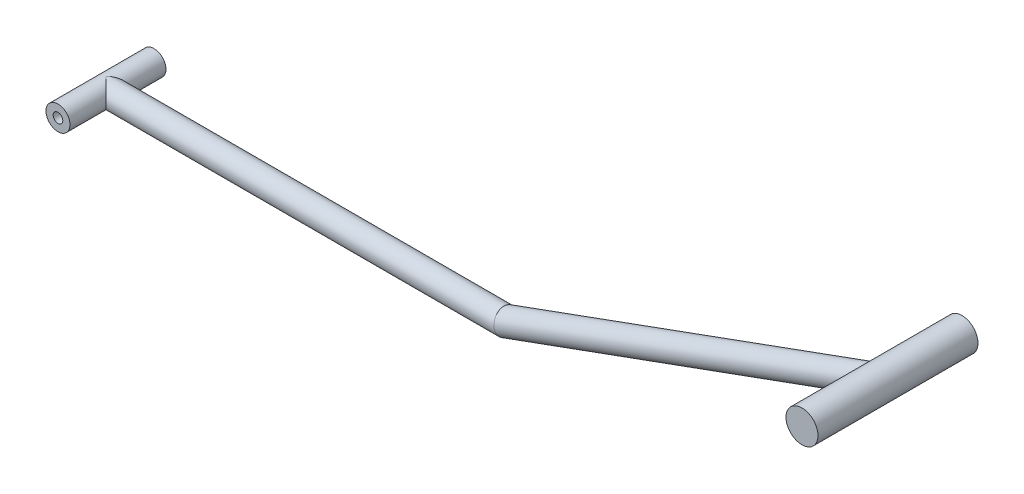
ISO-10303-21;
HEADER;
FILE_DESCRIPTION(('STEP AP214'),'2;1');
FILE_NAME('part.step','',(''),(''),'','','');
FILE_SCHEMA(('AUTOMOTIVE_DESIGN { 1 0 10303 214 1 1 1 1 }'));
ENDSEC;
DATA;
#1=APPLICATION_CONTEXT('core data for automotive mechanical design processes');
#2=APPLICATION_PROTOCOL_DEFINITION('international standard','automotive_design',2000,#1);
#3=PRODUCT_CONTEXT('',#1,'mechanical');
#4=PRODUCT('Part','Part','',(#3));
#5=PRODUCT_RELATED_PRODUCT_CATEGORY('part','',(#4));
#6=PRODUCT_DEFINITION_FORMATION('','',#4);
#7=PRODUCT_DEFINITION_CONTEXT('part definition',#1,'design');
#8=PRODUCT_DEFINITION('design','',#6,#7);
#9=PRODUCT_DEFINITION_SHAPE('','',#8);
#10=(LENGTH_UNIT() NAMED_UNIT(*) SI_UNIT(.MILLI.,.METRE.));
#11=(NAMED_UNIT(*) PLANE_ANGLE_UNIT() SI_UNIT($,.RADIAN.));
#12=(NAMED_UNIT(*) SI_UNIT($,.STERADIAN.) SOLID_ANGLE_UNIT());
#13=UNCERTAINTY_MEASURE_WITH_UNIT(LENGTH_MEASURE(1.E-05),#10,'distance_accuracy_value','');
#14=(GEOMETRIC_REPRESENTATION_CONTEXT(3) GLOBAL_UNCERTAINTY_ASSIGNED_CONTEXT((#13)) GLOBAL_UNIT_ASSIGNED_CONTEXT((#10,
#11,#12)) REPRESENTATION_CONTEXT('',''));
#15=CARTESIAN_POINT('',(0.,0.,0.));
#16=DIRECTION('',(0.,0.,1.));
#17=DIRECTION('',(1.,0.,0.));
#18=AXIS2_PLACEMENT_3D('',#15,#16,#17);
#19=CARTESIAN_POINT('',(500.,0.,0.));
#20=DIRECTION('',(0.939692620785908,0.34202014332567,0.));
#21=DIRECTION('',(-0.34202014332567,0.939692620785908,0.));
#22=AXIS2_PLACEMENT_3D('',#19,#20,#21);
#23=CYLINDRICAL_SURFACE('',#22,15.);
#24=CARTESIAN_POINT('',(500.,0.,0.));
#25=DIRECTION('',(0.984807753012208,0.173648177666931,0.));
#26=DIRECTION('',(-0.173648177666931,0.984807753012208,0.));
#27=AXIS2_PLACEMENT_3D('',#24,#25,#26);
#28=ELLIPSE('',#27,15.2313991782862,15.);
#29=CARTESIAN_POINT('',(497.355095289373,15.,0.));
#30=VERTEX_POINT('',#29);
#31=EDGE_CURVE('E115',#30,#30,#28,.T.);
#32=ORIENTED_EDGE('',*,*,#31,.T.);
#33=EDGE_LOOP('',(#32));
#34=FACE_BOUND('',#33,.T.);
#35=CARTESIAN_POINT('',(952.285043325859,180.580959761552,0.));
#36=CARTESIAN_POINT('',(952.285035394979,180.580951570368,-0.350079890327284));
#37=CARTESIAN_POINT('',(952.276112477174,180.564628821461,-0.700236713845612));
#38=CARTESIAN_POINT('',(952.241103360781,180.49995953954,-1.39674329707936));
#39=CARTESIAN_POINT('',(952.215011435861,180.451602322123,-1.74309174740025));
#40=CARTESIAN_POINT('',(952.14753257883,180.324491398012,-2.42936786240104));
#41=CARTESIAN_POINT('',(952.106112348691,180.245671499881,-2.76927984254844));
#42=CARTESIAN_POINT('',(952.010693107067,180.060022505329,-3.43970761587677));
#43=CARTESIAN_POINT('',(951.956685790914,179.953174911015,-3.7702170432241));
#44=CARTESIAN_POINT('',(951.840013290502,179.715843998583,-4.41546480166884));
#45=CARTESIAN_POINT('',(951.777482856538,179.585720255885,-4.73036101087507));
#46=CARTESIAN_POINT('',(951.646120155267,179.30328046254,-5.34847307548837));
#47=CARTESIAN_POINT('',(951.577290085453,179.150972139626,-5.65169295189166));
#48=CARTESIAN_POINT('',(951.436019291546,178.82624217578,-6.24616943381674));
#49=CARTESIAN_POINT('',(951.36357919823,178.653824041617,-6.53742811320166));
#50=CARTESIAN_POINT('',(951.217506745819,178.290594197341,-7.10791224058057));
#51=CARTESIAN_POINT('',(951.143874300568,178.099781153082,-7.38713681363696));
#52=CARTESIAN_POINT('',(950.982275155464,177.659437756766,-7.99071956284561));
#53=CARTESIAN_POINT('',(950.894536949365,177.405980670003,-8.31227897723427));
#54=CARTESIAN_POINT('',(950.723953464106,176.876323819218,-8.937465429897));
#55=CARTESIAN_POINT('',(950.641108588332,176.600122184705,-9.24109098977483));
#56=CARTESIAN_POINT('',(950.483285290792,176.026239761778,-9.830383058356));
#57=CARTESIAN_POINT('',(950.408318079182,175.72852935508,-10.1160237485836));
#58=CARTESIAN_POINT('',(950.269232209009,175.11342070539,-10.6681497813647));
#59=CARTESIAN_POINT('',(950.20511445171,174.796020829784,-10.9346335314949));
#60=CARTESIAN_POINT('',(950.078682144025,174.076067930734,-11.4998486946517));
#61=CARTESIAN_POINT('',(950.019418657432,173.669376244951,-11.7940279078986));
#62=CARTESIAN_POINT('',(949.925002504532,172.831908304601,-12.35056384938));
#63=CARTESIAN_POINT('',(949.889855252098,172.401126665522,-12.6129134212812));
#64=CARTESIAN_POINT('',(949.847938424697,171.519488023194,-13.1020621368341));
#65=CARTESIAN_POINT('',(949.841114780598,171.068670932341,-13.3289282198199));
#66=CARTESIAN_POINT('',(949.859531178955,170.15025470405,-13.7439395955393));
#67=CARTESIAN_POINT('',(949.884754208737,169.682664598951,-13.9321053715779));
#68=CARTESIAN_POINT('',(949.957431967535,168.878678256954,-14.2155206181018));
#69=CARTESIAN_POINT('',(949.995882802748,168.545265123088,-14.3216751503083));
#70=CARTESIAN_POINT('',(950.09069492342,167.874757382898,-14.5119991391524));
#71=CARTESIAN_POINT('',(950.147051930116,167.537663674627,-14.5961738392267));
#72=CARTESIAN_POINT('',(950.27811800607,166.862289111349,-14.7413760869837));
#73=CARTESIAN_POINT('',(950.352814770171,166.524009201627,-14.8024190854446));
#74=CARTESIAN_POINT('',(950.520690731582,165.848528796575,-14.9005493680025));
#75=CARTESIAN_POINT('',(950.613870591259,165.511328340369,-14.9376357933791));
#76=CARTESIAN_POINT('',(950.818675832146,164.839765727133,-14.9873357006868));
#77=CARTESIAN_POINT('',(950.930348909081,164.505413323198,-14.9998847978291));
#78=CARTESIAN_POINT('',(951.171235639458,163.843080701791,-15.0001136198624));
#79=CARTESIAN_POINT('',(951.300449223488,163.51510045911,-14.9877934431648));
#80=CARTESIAN_POINT('',(951.575314901971,162.867937453886,-14.9384782769663));
#81=CARTESIAN_POINT('',(951.720970241166,162.54875644337,-14.901478409887));
#82=CARTESIAN_POINT('',(952.02723584515,161.921485118932,-14.8033777740602));
#83=CARTESIAN_POINT('',(952.187846010679,161.613394731416,-14.7422771652691));
#84=CARTESIAN_POINT('',(952.516552769728,161.02055609772,-14.5993796559604));
#85=CARTESIAN_POINT('',(952.684202095385,160.735369501426,-14.5183665754015));
#86=CARTESIAN_POINT('',(953.030165060002,160.178417430502,-14.3357338481969));
#87=CARTESIAN_POINT('',(953.208478377782,159.906651552115,-14.2341148219448));
#88=CARTESIAN_POINT('',(953.574043081298,159.377499112088,-14.0114083976574));
#89=CARTESIAN_POINT('',(953.761294921958,159.120113283766,-13.8903200079904));
#90=CARTESIAN_POINT('',(954.143004679217,158.62035466796,-13.6298601756865));
#91=CARTESIAN_POINT('',(954.33746357578,158.377983934181,-13.4904862401191));
#92=CARTESIAN_POINT('',(954.753201605071,157.883250045754,-13.1786322414654));
#93=CARTESIAN_POINT('',(954.975106408877,157.632642372954,-13.0042018371786));
#94=CARTESIAN_POINT('',(955.423385773005,157.150503516616,-12.6358530539303));
#95=CARTESIAN_POINT('',(955.649760605216,156.918973497928,-12.4419334865935));
#96=CARTESIAN_POINT('',(956.104948565098,156.474729346754,-12.0358210694147));
#97=CARTESIAN_POINT('',(956.333763212955,156.262027818733,-11.823616163475));
#98=CARTESIAN_POINT('',(956.79156569241,155.855289517769,-11.3821811130354));
#99=CARTESIAN_POINT('',(957.020553539192,155.661254636006,-11.1529492476373));
#100=CARTESIAN_POINT('',(957.521450020052,155.255034021643,-10.6316991686251));
#101=CARTESIAN_POINT('',(957.792940310002,155.046786779839,-10.3362007154334));
#102=CARTESIAN_POINT('',(958.329402443913,154.655528748979,-9.72330383845392));
#103=CARTESIAN_POINT('',(958.594373019683,154.472522838386,-9.40590119891696));
#104=CARTESIAN_POINT('',(959.113814321785,154.130788109924,-8.74979915450473));
#105=CARTESIAN_POINT('',(959.36827942119,153.972072182119,-8.41108857565753));
#106=CARTESIAN_POINT('',(959.861870525601,153.67821098656,-7.71294764061107));
#107=CARTESIAN_POINT('',(960.100999951176,153.543060450987,-7.35352193904446));
#108=CARTESIAN_POINT('',(960.513323576251,153.319990017521,-6.68701295227658));
#109=CARTESIAN_POINT('',(960.690223905214,153.22801132422,-6.38357579620483));
#110=CARTESIAN_POINT('',(961.027228109249,153.058488083565,-5.76355405942485));
#111=CARTESIAN_POINT('',(961.187332174789,152.980943372522,-5.44696962786276));
#112=CARTESIAN_POINT('',(961.486584287395,152.840253792041,-4.80163600989984));
#113=CARTESIAN_POINT('',(961.625770735245,152.77708242347,-4.47291052978984));
#114=CARTESIAN_POINT('',(961.879229661384,152.664912423681,-3.80362399006014));
#115=CARTESIAN_POINT('',(961.993508634505,152.615910096677,-3.46306604277392));
#116=CARTESIAN_POINT('',(962.17300642091,152.540423090953,-2.84026434696773));
#117=CARTESIAN_POINT('',(962.243459415962,152.511400625758,-2.55983497252525));
#118=CARTESIAN_POINT('',(962.363415974223,152.462551453581,-1.99372983448262));
#119=CARTESIAN_POINT('',(962.412922219082,152.442723569457,-1.70805474733884));
#120=CARTESIAN_POINT('',(962.489264074328,152.412341423278,-1.13349558316199));
#121=CARTESIAN_POINT('',(962.516124282461,152.401777098798,-0.844615334096654));
#122=CARTESIAN_POINT('',(962.546272589505,152.389928866487,-0.265421830879197));
#123=CARTESIAN_POINT('',(962.549560446007,152.388645054093,0.0248914379789201));
#124=CARTESIAN_POINT('',(962.532433883311,152.395365355506,0.60479891875916));
#125=CARTESIAN_POINT('',(962.512011662527,152.403372526427,0.894392862565568));
#126=CARTESIAN_POINT('',(962.448220684865,152.428644590126,1.47060869461543));
#127=CARTESIAN_POINT('',(962.404851901696,152.445909493513,1.7572305794532));
#128=CARTESIAN_POINT('',(962.296615599498,152.489663952572,2.32600868418188));
#129=CARTESIAN_POINT('',(962.23172147793,152.516164924899,2.60815892332707));
#130=CARTESIAN_POINT('',(962.08243626933,152.578338601556,3.16634198771798));
#131=CARTESIAN_POINT('',(961.998033747456,152.614016686438,3.4423711206758));
#132=CARTESIAN_POINT('',(961.777170805841,152.709569708567,4.08915667335912));
#133=CARTESIAN_POINT('',(961.633048959773,152.773503233812,4.45670766039744));
#134=CARTESIAN_POINT('',(961.318175930523,152.918611471092,5.17650775566839));
#135=CARTESIAN_POINT('',(961.14742467208,152.999786231854,5.52875682065046));
#136=CARTESIAN_POINT('',(960.784332848733,153.179713458969,6.21795386001166));
#137=CARTESIAN_POINT('',(960.591958312621,153.278493731107,6.55487655591859));
#138=CARTESIAN_POINT('',(960.190489126647,153.493878827728,7.21256450610925));
#139=CARTESIAN_POINT('',(959.981395987555,153.610482042515,7.53333121606179));
#140=CARTESIAN_POINT('',(959.542742856393,153.866464924243,8.16973820461784));
#141=CARTESIAN_POINT('',(959.312719829831,154.00650613084,8.48479239336122));
#142=CARTESIAN_POINT('',(958.842662359113,154.306852215789,9.09725927872138));
#143=CARTESIAN_POINT('',(958.602627876274,154.467157172443,9.3946719071631));
#144=CARTESIAN_POINT('',(958.115696321532,154.808800466309,9.97152383545821));
#145=CARTESIAN_POINT('',(957.868796276479,154.990148027433,10.2509551692431));
#146=CARTESIAN_POINT('',(957.371198150541,155.374520824421,10.7909545658105));
#147=CARTESIAN_POINT('',(957.120499641853,155.577548517831,11.0515204844788));
#148=CARTESIAN_POINT('',(956.56321894267,156.05275787465,11.6074930001008));
#149=CARTESIAN_POINT('',(956.256396307295,156.330356233547,11.8980704729058));
#150=CARTESIAN_POINT('',(955.646361133061,156.919602955636,12.4470273815063));
#151=CARTESIAN_POINT('',(955.343149427752,157.231259018016,12.7053995084891));
#152=CARTESIAN_POINT('',(954.746152769952,157.888261096336,13.1861994708642));
#153=CARTESIAN_POINT('',(954.452352592608,158.233548625413,13.408687980918));
#154=CARTESIAN_POINT('',(953.879225891524,158.957478202446,13.8144291894272));
#155=CARTESIAN_POINT('',(953.599891618469,159.336102092494,13.997703063275));
#156=CARTESIAN_POINT('',(953.143416141939,160.004451531797,14.271893629202));
#157=CARTESIAN_POINT('',(952.961068721927,160.286116270991,14.373936583565));
#158=CARTESIAN_POINT('',(952.607966661532,160.863451611545,14.5559953401007));
#159=CARTESIAN_POINT('',(952.437209266801,161.159118856679,14.6360163896429));
#160=CARTESIAN_POINT('',(952.109193148003,161.762769724231,14.7729141880236));
#161=CARTESIAN_POINT('',(951.951925054529,162.07074457646,14.8298071056261));
#162=CARTESIAN_POINT('',(951.652386902636,162.697327398779,14.9196977597463));
#163=CARTESIAN_POINT('',(951.510117404771,163.0159357657,14.952694603447));
#164=CARTESIAN_POINT('',(951.241657695481,163.662306742603,14.9943238587307));
#165=CARTESIAN_POINT('',(951.115506282761,163.990089209112,15.0028984998101));
#166=CARTESIAN_POINT('',(950.88073804593,164.651593741919,14.9953811079746));
#167=CARTESIAN_POINT('',(950.772121146123,164.985315782568,14.9792891815465));
#168=CARTESIAN_POINT('',(950.573061556681,165.656163626906,14.9226897715005));
#169=CARTESIAN_POINT('',(950.482622972056,165.993290181388,14.8821767813829));
#170=CARTESIAN_POINT('',(950.320193224634,166.668268902387,14.7773548477151));
#171=CARTESIAN_POINT('',(950.248202011214,167.006121066909,14.713045969468));
#172=CARTESIAN_POINT('',(950.124336335895,167.670234721735,14.5637744447823));
#173=CARTESIAN_POINT('',(950.071936474842,167.996546913817,14.4794687585441));
#174=CARTESIAN_POINT('',(949.983890799455,168.645436864423,14.2903589794548));
#175=CARTESIAN_POINT('',(949.948244542876,168.968014721303,14.1855554277883));
#176=CARTESIAN_POINT('',(949.89296029807,169.607618888372,13.9566061086172));
#177=CARTESIAN_POINT('',(949.873323007218,169.924644956128,13.8324594987793));
#178=CARTESIAN_POINT('',(949.8491049196,170.551580361661,13.5660152984597));
#179=CARTESIAN_POINT('',(949.844526193073,170.861488715083,13.4237152150451));
#180=CARTESIAN_POINT('',(949.849600141078,171.507418536314,13.1050742462934));
#181=CARTESIAN_POINT('',(949.860922267886,171.842425389542,12.9267034353408));
#182=CARTESIAN_POINT('',(949.899188220331,172.500350349657,12.5504514430559));
#183=CARTESIAN_POINT('',(949.926133050445,172.823267677815,12.3525690078846));
#184=CARTESIAN_POINT('',(949.993879170963,173.455937523302,11.9384878595635));
#185=CARTESIAN_POINT('',(950.034690599591,173.765680221355,11.7222758322299));
#186=CARTESIAN_POINT('',(950.128290445003,174.370636902232,11.2727851475034));
#187=CARTESIAN_POINT('',(950.181080055504,174.665849433442,11.0395047906924));
#188=CARTESIAN_POINT('',(950.308128050934,175.297579377575,10.5090255588309));
#189=CARTESIAN_POINT('',(950.384567593333,175.63071430076,10.2083115792526));
#190=CARTESIAN_POINT('',(950.548311766677,176.272871978233,9.58480793920664));
#191=CARTESIAN_POINT('',(950.635618611421,176.581889798653,9.26201378679727));
#192=CARTESIAN_POINT('',(950.817294110446,177.17387141365,8.59493671544249));
#193=CARTESIAN_POINT('',(950.911665896384,177.456823528709,8.25064427836343));
#194=CARTESIAN_POINT('',(951.103149020438,177.99399159523,7.54109685973961));
#195=CARTESIAN_POINT('',(951.200259643056,178.248214966512,7.17584732773013));
#196=CARTESIAN_POINT('',(951.371580238919,178.673293211129,6.50569680145405));
#197=CARTESIAN_POINT('',(951.446207165951,178.850296309699,6.20479543270992));
#198=CARTESIAN_POINT('',(951.591454196701,179.182777718729,5.59032001058236));
#199=CARTESIAN_POINT('',(951.662074290292,179.338255974779,5.27674592516712));
#200=CARTESIAN_POINT('',(951.796178260846,179.625044042555,4.63807310455017));
#201=CARTESIAN_POINT('',(951.859677670365,179.756406873419,4.31300157182171));
#202=CARTESIAN_POINT('',(951.976527090705,179.992736137374,3.6516319103328));
#203=CARTESIAN_POINT('',(952.029880648593,180.097711799766,3.31533775359901));
#204=CARTESIAN_POINT('',(952.109599742505,180.252055262972,2.73320744189122));
#205=CARTESIAN_POINT('',(952.139292246899,180.308703873345,2.48974190614368));
#206=CARTESIAN_POINT('',(952.191030902576,180.406569991839,1.9989433993067));
#207=CARTESIAN_POINT('',(952.213078543796,180.447790506928,1.7516111916395));
#208=CARTESIAN_POINT('',(952.248703618808,180.514053109089,1.25425989973619));
#209=CARTESIAN_POINT('',(952.26228417828,180.539101166454,1.00424184171237));
#210=CARTESIAN_POINT('',(952.280456014645,180.572555832482,0.502828901264622));
#211=CARTESIAN_POINT('',(952.285049021973,180.580965644622,0.251434293226218));
#212=CARTESIAN_POINT('',(952.285043325859,180.580959761552,0.));
#213=B_SPLINE_CURVE_WITH_KNOTS('',3,(#35,#36,#37,#38,#39,#40,#41,#42,#43,#44,#45,#46,#47,#48,
#49,#50,#51,#52,#53,#54,#55,#56,#57,#58,#59,#60,#61,#62,#63,#64,#65,#66,#67,#68,#69,#70,#71,#72,
#73,#74,#75,#76,#77,#78,#79,#80,#81,#82,#83,#84,#85,#86,#87,#88,#89,#90,#91,#92,#93,#94,#95,#96,
#97,#98,#99,#100,#101,#102,#103,#104,#105,#106,#107,#108,#109,#110,#111,#112,#113,#114,#115,
#116,#117,#118,#119,#120,#121,#122,#123,#124,#125,#126,#127,#128,#129,#130,#131,#132,#133,#134,
#135,#136,#137,#138,#139,#140,#141,#142,#143,#144,#145,#146,#147,#148,#149,#150,#151,#152,#153,
#154,#155,#156,#157,#158,#159,#160,#161,#162,#163,#164,#165,#166,#167,#168,#169,#170,#171,#172,
#173,#174,#175,#176,#177,#178,#179,#180,#181,#182,#183,#184,#185,#186,#187,#188,#189,#190,#191,
#192,#193,#194,#195,#196,#197,#198,#199,#200,#201,#202,#203,#204,#205,#206,#207,#208,#209,#210,
#211,#212),.UNSPECIFIED.,.T.,.F.,(4,2,2,2,2,2,2,2,2,2,2,2,2,2,2,2,2,2,2,2,2,2,2,2,2,2,2,2,2,2,2,
2,2,2,2,2,2,2,2,2,2,2,2,2,2,2,2,2,2,2,2,2,2,2,2,2,2,2,2,2,2,2,2,2,2,2,2,2,2,2,2,2,2,2,2,2,2,2,2,
2,2,2,2,2,2,2,2,2,4),(0.,1.04989330861707,2.10013696283709,3.15267560731795,4.20591066822563,
5.24409491293168,6.28191837964795,7.31956113954815,8.35727921425447,9.61238500518639,
10.8675941180987,12.1245659086802,13.3816420646878,14.8958300903929,16.4103579261516,
17.9219932288364,19.4328263822248,20.4878122457487,21.5425462048999,22.5965744093588,
23.6506403932288,24.7074685043305,25.7642924334172,26.8213252901473,27.8783511314817,
28.8990338141558,29.9196857711866,30.9403897294913,31.9612329887076,33.0925115159598,
34.2238590661887,35.3559583421495,36.4881721943809,37.8431193809283,39.1983280761279,
40.5542534701804,41.9098753703413,42.9983087099467,44.0867297054508,45.1731274949132,
46.2592416572738,47.1301725976503,48.000992005808,48.8708643215188,49.7407455827083,
50.610913151615,51.4810817175363,52.352329731439,53.2240897280179,54.4220718811335,
55.6200574201,56.8199520758416,58.0197384258866,59.2621109686762,60.50448831225,
61.7474123171765,62.9904773633283,64.505180576884,66.0202269199128,67.5326840275837,
69.0443223554228,70.095408171734,71.1462433185052,72.196342562949,73.2464810396968,
74.2991015548625,75.351717525825,76.4045709311067,77.4574214470611,78.4795702327711,
79.5016920353465,80.523858360771,81.5461652070034,82.6841827772837,83.8222735255745,
84.9611981580044,86.1002363428384,87.4646132818952,88.8292686170736,90.1945324824972,
91.5594429292258,92.6296192030637,93.6997981820693,94.7675953717634,95.8350185623947,
96.5896437436551,97.3441217702318,98.0983211110213,98.852375226407),.UNSPECIFIED.);
#214=CARTESIAN_POINT('',(952.285043325859,180.580959761552,0.));
#215=VERTEX_POINT('',#214);
#216=EDGE_CURVE('E39',#215,#215,#213,.T.);
#217=ORIENTED_EDGE('',*,*,#216,.T.);
#218=EDGE_LOOP('',(#217));
#219=FACE_BOUND('',#218,.T.);
#220=ADVANCED_FACE('F35',(#34,#219),#23,.T.);
#221=CARTESIAN_POINT('',(0.,0.,60.));
#222=DIRECTION('',(0.,0.,-1.));
#223=DIRECTION('',(-1.,0.,0.));
#224=AXIS2_PLACEMENT_3D('',#221,#222,#223);
#225=CYLINDRICAL_SURFACE('',#224,15.);
#226=CARTESIAN_POINT('',(0.,0.,-60.));
#227=DIRECTION('',(0.,0.,1.));
#228=DIRECTION('',(1.,0.,0.));
#229=AXIS2_PLACEMENT_3D('',#226,#227,#228);
#230=CIRCLE('',#229,15.);
#231=CARTESIAN_POINT('',(15.,0.,-60.));
#232=VERTEX_POINT('',#231);
#233=EDGE_CURVE('E136',#232,#232,#230,.T.);
#234=ORIENTED_EDGE('',*,*,#233,.T.);
#235=EDGE_LOOP('',(#234));
#236=FACE_BOUND('',#235,.T.);
#237=CARTESIAN_POINT('',(0.,0.,60.));
#238=DIRECTION('',(0.,0.,1.));
#239=DIRECTION('',(1.,0.,0.));
#240=AXIS2_PLACEMENT_3D('',#237,#238,#239);
#241=CIRCLE('',#240,15.);
#242=CARTESIAN_POINT('',(15.,0.,60.));
#243=VERTEX_POINT('',#242);
#244=EDGE_CURVE('E82',#243,#243,#241,.T.);
#245=ORIENTED_EDGE('',*,*,#244,.F.);
#246=EDGE_LOOP('',(#245));
#247=FACE_BOUND('',#246,.T.);
#248=CARTESIAN_POINT('',(0.,0.,0.));
#249=DIRECTION('',(-0.707106781186547,0.,-0.707106781186547));
#250=DIRECTION('',(0.707106781186547,0.,-0.707106781186547));
#251=AXIS2_PLACEMENT_3D('',#248,#249,#250);
#252=ELLIPSE('',#251,21.2132034355964,15.);
#253=CARTESIAN_POINT('',(0.,-15.,0.));
#254=VERTEX_POINT('',#253);
#255=CARTESIAN_POINT('',(0.,15.,0.));
#256=VERTEX_POINT('',#255);
#257=EDGE_CURVE('E130',#254,#256,#252,.F.);
#258=ORIENTED_EDGE('',*,*,#257,.F.);
#259=CARTESIAN_POINT('',(0.,0.,0.));
#260=DIRECTION('',(0.707106781186547,0.,-0.707106781186547));
#261=DIRECTION('',(-0.707106781186547,0.,-0.707106781186547));
#262=AXIS2_PLACEMENT_3D('',#259,#260,#261);
#263=ELLIPSE('',#262,21.2132034355964,15.);
#264=EDGE_CURVE('E54',#256,#254,#263,.T.);
#265=ORIENTED_EDGE('',*,*,#264,.F.);
#266=EDGE_LOOP('',(#258,#265));
#267=FACE_BOUND('',#266,.T.);
#268=ADVANCED_FACE('F37',(#236,#247,#267),#225,.T.);
#269=CARTESIAN_POINT('',(0.,0.,60.));
#270=DIRECTION('',(0.,0.,-1.));
#271=DIRECTION('',(-1.,0.,0.));
#272=AXIS2_PLACEMENT_3D('',#269,#270,#271);
#273=CYLINDRICAL_SURFACE('',#272,6.);
#274=CARTESIAN_POINT('',(0.,0.,-60.));
#275=DIRECTION('',(0.,0.,1.));
#276=DIRECTION('',(1.,0.,0.));
#277=AXIS2_PLACEMENT_3D('',#274,#275,#276);
#278=CIRCLE('',#277,6.);
#279=CARTESIAN_POINT('',(6.,0.,-60.));
#280=VERTEX_POINT('',#279);
#281=EDGE_CURVE('E132',#280,#280,#278,.T.);
#282=ORIENTED_EDGE('',*,*,#281,.F.);
#283=EDGE_LOOP('',(#282));
#284=FACE_BOUND('',#283,.T.);
#285=CARTESIAN_POINT('',(0.,0.,60.));
#286=DIRECTION('',(0.,0.,1.));
#287=DIRECTION('',(1.,0.,0.));
#288=AXIS2_PLACEMENT_3D('',#285,#286,#287);
#289=CIRCLE('',#288,6.);
#290=CARTESIAN_POINT('',(6.,0.,60.));
#291=VERTEX_POINT('',#290);
#292=EDGE_CURVE('E133',#291,#291,#289,.T.);
#293=ORIENTED_EDGE('',*,*,#292,.T.);
#294=EDGE_LOOP('',(#293));
#295=FACE_BOUND('',#294,.T.);
#296=CARTESIAN_POINT('',(-6.,0.,15.));
#297=CARTESIAN_POINT('',(-5.99999907633706,0.161313644504795,14.9999992799423));
#298=CARTESIAN_POINT('',(-5.99348550139582,0.322689516963508,14.9973905442872));
#299=CARTESIAN_POINT('',(-5.96748987821247,0.644299623195491,14.9870209396163));
#300=CARTESIAN_POINT('',(-5.94799916844521,0.80453302218813,14.9792566295469));
#301=CARTESIAN_POINT('',(-5.89618961968034,1.12295032515216,14.9587594719095));
#302=CARTESIAN_POINT('',(-5.86384328218401,1.28112908028619,14.9460159747332));
#303=CARTESIAN_POINT('',(-5.78663177014574,1.59401110108469,14.9158923525357));
#304=CARTESIAN_POINT('',(-5.741761479865,1.74871291854088,14.8985103329152));
#305=CARTESIAN_POINT('',(-5.64011880463919,2.05297112205075,14.85963474988));
#306=CARTESIAN_POINT('',(-5.58339119593629,2.20254446893524,14.8381566801894));
#307=CARTESIAN_POINT('',(-5.45840170244081,2.49626491179011,14.7915782226374));
#308=CARTESIAN_POINT('',(-5.39013550937534,2.64040995626988,14.7664764822838));
#309=CARTESIAN_POINT('',(-5.24266819714285,2.92227692731373,14.7132880124765));
#310=CARTESIAN_POINT('',(-5.16347555520486,3.06000372368526,14.6852036009652));
#311=CARTESIAN_POINT('',(-4.99467518366883,3.32842124549353,14.6267056927006));
#312=CARTESIAN_POINT('',(-4.90506368451759,3.45910939916273,14.5962913543435));
#313=CARTESIAN_POINT('',(-4.61340096802569,3.8503463050522,14.4999578839521));
#314=CARTESIAN_POINT('',(-4.39475150378829,4.09812078052022,14.4312855983673));
#315=CARTESIAN_POINT('',(-3.91972848220131,4.55459108369287,14.2938006085538));
#316=CARTESIAN_POINT('',(-3.66333657769938,4.76326779263536,14.2249878521747));
#317=CARTESIAN_POINT('',(-3.24887569858755,5.04723766459798,14.1257237119283));
#318=CARTESIAN_POINT('',(-3.1022648970436,5.13866506559553,14.0926348838902));
#319=CARTESIAN_POINT('',(-2.8012358186711,5.30875946518037,14.0294439987206));
#320=CARTESIAN_POINT('',(-2.64682078712387,5.38743171147838,13.9993407152693));
#321=CARTESIAN_POINT('',(-2.33114969334845,5.53135072514938,13.9431035259271));
#322=CARTESIAN_POINT('',(-2.1698931693136,5.59659658448498,13.9169698885377));
#323=CARTESIAN_POINT('',(-1.84174929930481,5.71298893930062,13.8695965651366));
#324=CARTESIAN_POINT('',(-1.67486482116359,5.76414249748569,13.8483544285077));
#325=CARTESIAN_POINT('',(-1.34428057885177,5.84985002952935,13.812361071961));
#326=CARTESIAN_POINT('',(-1.18077440622038,5.88504634552834,13.7973611781672));
#327=CARTESIAN_POINT('',(-0.851047582104776,5.94169028877152,13.7730632035884));
#328=CARTESIAN_POINT('',(-0.684828191369743,5.96314412514811,13.763762547854));
#329=CARTESIAN_POINT('',(-0.350984079492432,5.99206783200916,13.7511953307051));
#330=CARTESIAN_POINT('',(-0.183359662748449,5.99954065663821,13.7479274945764));
#331=CARTESIAN_POINT('',(0.151929099875551,6.00041818162586,13.7475446397));
#332=CARTESIAN_POINT('',(0.319593443528542,5.99382353813072,13.7504293339811));
#333=CARTESIAN_POINT('',(0.641884927740917,5.96760177471961,13.7618280557533));
#334=CARTESIAN_POINT('',(0.796604370498164,5.94891756277296,13.7699346208222));
#335=CARTESIAN_POINT('',(1.10384080655501,5.8996396544996,13.7911192754836));
#336=CARTESIAN_POINT('',(1.25635705783037,5.86904203850858,13.8041990012772));
#337=CARTESIAN_POINT('',(1.55807979901831,5.79624600676145,13.8349228158605));
#338=CARTESIAN_POINT('',(1.7072870764518,5.75405038400524,13.8525658056772));
#339=CARTESIAN_POINT('',(2.00156268396213,5.65841794933909,13.8919033105674));
#340=CARTESIAN_POINT('',(2.14662939897561,5.60497681726873,13.9135993823432));
#341=CARTESIAN_POINT('',(2.43458921196665,5.48612076549079,13.9608971317125));
#342=CARTESIAN_POINT('',(2.57738076705269,5.42048769239742,13.9865682596972));
#343=CARTESIAN_POINT('',(2.85699543036736,5.27846344073437,14.0407834641431));
#344=CARTESIAN_POINT('',(2.99381649693463,5.20206861926844,14.0693285125008));
#345=CARTESIAN_POINT('',(3.26075619750076,5.03904071569064,14.1285380661927));
#346=CARTESIAN_POINT('',(3.39087393057647,4.95240626250741,14.1592028551284));
#347=CARTESIAN_POINT('',(3.64375143276673,4.7694272064266,14.2218815851021));
#348=CARTESIAN_POINT('',(3.76651082161022,4.67308210238212,14.2538955957211));
#349=CARTESIAN_POINT('',(4.01328743918054,4.46337699329053,14.321009166178));
#350=CARTESIAN_POINT('',(4.13666401644284,4.34927691149483,14.3561554862976));
#351=CARTESIAN_POINT('',(4.37341997604956,4.11112913327325,14.4261573040414));
#352=CARTESIAN_POINT('',(4.48680229611004,3.98708438059708,14.46101288438));
#353=CARTESIAN_POINT('',(4.70297656358241,3.72964838124062,14.5295379121774));
#354=CARTESIAN_POINT('',(4.80576237352026,3.59625179230496,14.563206664882));
#355=CARTESIAN_POINT('',(4.99993388757555,3.32099627612082,14.6284304794354));
#356=CARTESIAN_POINT('',(5.09132414487588,3.17914076240928,14.6599863831411));
#357=CARTESIAN_POINT('',(5.26379970633357,2.88480363244261,14.7207656025778));
#358=CARTESIAN_POINT('',(5.34463859680639,2.73216491576377,14.7499286757954));
#359=CARTESIAN_POINT('',(5.49305024742827,2.41997061448609,14.8043518853361));
#360=CARTESIAN_POINT('',(5.56062834419929,2.26041784404165,14.8296135908351));
#361=CARTESIAN_POINT('',(5.68189175291899,1.93550182558386,14.875508159045));
#362=CARTESIAN_POINT('',(5.73557981900943,1.77013973685015,14.8961419392815));
#363=CARTESIAN_POINT('',(5.82850487317263,1.43484781894989,14.9321676804159));
#364=CARTESIAN_POINT('',(5.86774286179574,1.26491830691483,14.9475600042365));
#365=CARTESIAN_POINT('',(5.92943749531374,0.932043665210946,14.9718895403));
#366=CARTESIAN_POINT('',(5.95275025468264,0.769280790194169,14.9811550169986));
#367=CARTESIAN_POINT('',(5.9859416474469,0.442179347982648,14.9943744084218));
#368=CARTESIAN_POINT('',(5.99582094260848,0.277840858808295,14.9983285847944));
#369=CARTESIAN_POINT('',(6.00203664635711,-0.0510959013325353,15.000814515054));
#370=CARTESIAN_POINT('',(5.99837604239609,-0.215694106984594,14.9993474650838));
#371=CARTESIAN_POINT('',(5.97755913806226,-0.543895620115942,14.9910347173186));
#372=CARTESIAN_POINT('',(5.96040309644145,-0.707498946609736,14.9841891226479));
#373=CARTESIAN_POINT('',(5.91386131774214,-1.02510006060182,14.9657383242369));
#374=CARTESIAN_POINT('',(5.88506327725836,-1.17919782151467,14.9543621875242));
#375=CARTESIAN_POINT('',(5.81560059386885,-1.48434586639605,14.9271627907189));
#376=CARTESIAN_POINT('',(5.77493206810542,-1.63539513588515,14.9113380755507));
#377=CARTESIAN_POINT('',(5.68211166216053,-1.93337901855315,14.8756364442751));
#378=CARTESIAN_POINT('',(5.62996296955663,-2.08031476115196,14.8557606531008));
#379=CARTESIAN_POINT('',(5.51459039707872,-2.36928412673676,14.8124221315374));
#380=CARTESIAN_POINT('',(5.45136230411881,-2.51131586022716,14.788958037083));
#381=CARTESIAN_POINT('',(5.31225631978153,-2.79382655828656,14.738240986786));
#382=CARTESIAN_POINT('',(5.2360540127242,-2.93412902369548,14.7108949918607));
#383=CARTESIAN_POINT('',(5.07295579131656,-3.20788342050321,14.653636047145));
#384=CARTESIAN_POINT('',(4.98605621255941,-3.34133298209497,14.6237222187979));
#385=CARTESIAN_POINT('',(4.80214466849659,-3.60064969677007,14.5620427444401));
#386=CARTESIAN_POINT('',(4.70513099772341,-3.72651556540458,14.5302767865174));
#387=CARTESIAN_POINT('',(4.50158537994664,-3.97000140926484,14.4656475212144));
#388=CARTESIAN_POINT('',(4.3950530183189,-4.08762102489383,14.4327841660717));
#389=CARTESIAN_POINT('',(4.16569829883037,-4.32151965753384,14.3645492876992));
#390=CARTESIAN_POINT('',(4.04226426963706,-4.4371933374226,14.3291558684875));
#391=CARTESIAN_POINT('',(3.78601523693189,-4.65775251008147,14.2589878283471));
#392=CARTESIAN_POINT('',(3.65320316765098,-4.76264135223885,14.2242130180919));
#393=CARTESIAN_POINT('',(3.3788427625011,-4.9610580489563,14.1562321861325));
#394=CARTESIAN_POINT('',(3.23728947765581,-5.05457937701834,14.1230270722696));
#395=CARTESIAN_POINT('',(2.94639783208029,-5.22948651451797,14.0592011706988));
#396=CARTESIAN_POINT('',(2.79706277899756,-5.31087742412303,14.0285792992444));
#397=CARTESIAN_POINT('',(2.48989739915933,-5.46168285847214,13.9705625756139));
#398=CARTESIAN_POINT('',(2.33199586936957,-5.53096653567013,13.9432038872192));
#399=CARTESIAN_POINT('',(2.01024592899011,-5.65585321672464,13.8930146747533));
#400=CARTESIAN_POINT('',(1.84640009801527,-5.71146207536686,13.8701822136217));
#401=CARTESIAN_POINT('',(1.51396706306604,-5.80843082990244,13.8298551049057));
#402=CARTESIAN_POINT('',(1.34538176688005,-5.84979637281906,13.8123583422014));
#403=CARTESIAN_POINT('',(1.00476569762631,-5.91782050130812,13.7833513444251));
#404=CARTESIAN_POINT('',(0.832735214250626,-5.94448031809037,13.7718406081887));
#405=CARTESIAN_POINT('',(0.499171061117712,-5.98138158194365,13.755851283804));
#406=CARTESIAN_POINT('',(0.337773536933935,-5.99266704417584,13.7509260111925));
#407=CARTESIAN_POINT('',(0.0145233510542001,-6.00216046200423,13.7467850410815));
#408=CARTESIAN_POINT('',(-0.147329290965072,-6.00036897454033,13.7475691004247));
#409=CARTESIAN_POINT('',(-0.470211220903614,-5.98373064604635,13.7548190919533));
#410=CARTESIAN_POINT('',(-0.631240606307353,-5.96888538854158,13.7612843349661));
#411=CARTESIAN_POINT('',(-0.951267774979586,-5.9263097432402,13.7796730336625));
#412=CARTESIAN_POINT('',(-1.11026556758983,-5.89857941471414,13.7915964642388));
#413=CARTESIAN_POINT('',(-1.41879511351042,-5.83188915830646,13.8199248571637));
#414=CARTESIAN_POINT('',(-1.56845168054464,-5.79342041323657,13.8361324385079));
#415=CARTESIAN_POINT('',(-1.86393032823804,-5.70522097391949,13.872733403532));
#416=CARTESIAN_POINT('',(-2.00975114209325,-5.65548660991751,13.8931281509704));
#417=CARTESIAN_POINT('',(-2.296647321415,-5.54517998972387,13.9375216393973));
#418=CARTESIAN_POINT('',(-2.43772331234237,-5.48460916869471,13.9615199030744));
#419=CARTESIAN_POINT('',(-2.71441172759269,-5.35307990924357,14.0124768698205));
#420=CARTESIAN_POINT('',(-2.85002214439658,-5.28211769758923,14.0394366473567));
#421=CARTESIAN_POINT('',(-3.26266441378977,-5.04570156991897,14.1269314560258));
#422=CARTESIAN_POINT('',(-3.52918514253622,-4.86295379872226,14.1914514609348));
#423=CARTESIAN_POINT('',(-4.02905084085624,-4.45761854712721,14.3239291441595));
#424=CARTESIAN_POINT('',(-4.26238577285283,-4.23501905872821,14.3918878541759));
#425=CARTESIAN_POINT('',(-4.59061111426665,-3.86726006921136,14.4935144880377));
#426=CARTESIAN_POINT('',(-4.69926699073618,-3.73448315683695,14.5283750359907));
#427=CARTESIAN_POINT('',(-4.90500130504219,-3.45982226643504,14.596218858185));
#428=CARTESIAN_POINT('',(-5.00208398697745,-3.31794165644068,14.6292028182708));
#429=CARTESIAN_POINT('',(-5.18404008301781,-3.02578567613311,14.692412478083));
#430=CARTESIAN_POINT('',(-5.26890193813059,-2.87550254240777,14.7226355566969));
#431=CARTESIAN_POINT('',(-5.42556550371114,-2.56769193761233,14.7794259622235));
#432=CARTESIAN_POINT('',(-5.49737318261119,-2.41016781863785,14.8059949584405));
#433=CARTESIAN_POINT('',(-5.62611984041648,-2.09182205260198,14.8542831233014));
#434=CARTESIAN_POINT('',(-5.68330479352407,-1.93111197302128,14.8760814885912));
#435=CARTESIAN_POINT('',(-5.78388280551449,-1.60493222642555,14.9147961660502));
#436=CARTESIAN_POINT('',(-5.82728234262731,-1.43946483501729,14.9317147710379));
#437=CARTESIAN_POINT('',(-5.89976280261093,-1.10541479414029,14.9601501413961));
#438=CARTESIAN_POINT('',(-5.9288796810461,-0.936841087451804,14.9716804678664));
#439=CARTESIAN_POINT('',(-5.97260907962451,-0.597618205770615,14.9890510773976));
#440=CARTESIAN_POINT('',(-5.98723258137454,-0.426970701489369,14.9948956684684));
#441=CARTESIAN_POINT('',(-5.99635639297294,-0.213390422685864,14.9985429447449));
#442=CARTESIAN_POINT('',(-5.99772244129,-0.170726823310689,14.9990891025036));
#443=CARTESIAN_POINT('',(-5.99954436681248,-0.0853769353554066,14.9998177253259));
#444=CARTESIAN_POINT('',(-6.00000024444162,-0.0426906467858719,15.0000001905588));
#445=CARTESIAN_POINT('',(-6.,0.,15.));
#446=B_SPLINE_CURVE_WITH_KNOTS('',3,(#296,#297,#298,#299,#300,#301,#302,#303,#304,#305,#306,
#307,#308,#309,#310,#311,#312,#313,#314,#315,#316,#317,#318,#319,#320,#321,#322,#323,#324,#325,
#326,#327,#328,#329,#330,#331,#332,#333,#334,#335,#336,#337,#338,#339,#340,#341,#342,#343,#344,
#345,#346,#347,#348,#349,#350,#351,#352,#353,#354,#355,#356,#357,#358,#359,#360,#361,#362,#363,
#364,#365,#366,#367,#368,#369,#370,#371,#372,#373,#374,#375,#376,#377,#378,#379,#380,#381,#382,
#383,#384,#385,#386,#387,#388,#389,#390,#391,#392,#393,#394,#395,#396,#397,#398,#399,#400,#401,
#402,#403,#404,#405,#406,#407,#408,#409,#410,#411,#412,#413,#414,#415,#416,#417,#418,#419,#420,
#421,#422,#423,#424,#425,#426,#427,#428,#429,#430,#431,#432,#433,#434,#435,#436,#437,#438,#439,
#440,#441,#442,#443,#444,#445),.UNSPECIFIED.,.T.,.F.,(4,2,2,2,2,2,2,2,2,2,2,2,2,2,2,2,2,2,2,2,2,
2,2,2,2,2,2,2,2,2,2,2,2,2,2,2,2,2,2,2,2,2,2,2,2,2,2,2,2,2,2,2,2,2,2,2,2,2,2,2,2,2,2,2,2,2,2,2,2,
2,2,2,2,2,4),(0.,0.483897054152818,0.968117407228013,1.45337914245595,1.93883938645661,
2.42249849868244,2.90633859994029,3.38980540538342,3.87344767714067,4.88128652111306,
5.88961691813349,6.41682474002603,6.94381510524777,7.47084109954819,7.99760247923351,
8.50070582790118,9.00358170358741,9.5063513111494,10.0090974686366,10.4767118882454,
10.9444802892416,11.4121361420904,11.879971982238,12.357167111748,12.8345241636783,
13.3119452055687,13.7893908988145,14.3038604025315,14.8181781750485,15.3327921850973,
15.8471999136586,16.3720340444751,16.8966565279702,17.4211749084574,17.945656963481,
18.4390821626358,18.9324830535441,19.4257750866616,19.9190576619765,20.3900487373938,
20.8611940478454,21.3322087049456,21.8034028617177,22.2888301938794,22.7744242768985,
23.2601003750447,23.7457976390534,24.2636804561109,24.7814019482706,25.299419292813,
25.8172182216539,26.3403070717152,26.8631715731926,27.3858285361306,27.9084417339339,
28.3934227501986,28.8783831115163,29.3632846514299,29.8481839608478,30.3137727734817,
30.7795134694854,31.2451925291595,31.7110411034411,32.695156070987,33.679568069738,
34.2042554172968,34.7287497567621,35.2537369726936,35.7784835549451,36.2937161550921,
36.8087062706881,37.3223931958723,37.8356906031082,37.9637509906823,38.0918113186414),.UNSPECIFIED.);
#447=CARTESIAN_POINT('',(0.,6.,13.7477270848675));
#448=VERTEX_POINT('',#447);
#449=CARTESIAN_POINT('',(0.,-6.,13.7477270848675));
#450=VERTEX_POINT('',#449);
#451=EDGE_CURVE('E48',#448,#450,#446,.T.);
#452=ORIENTED_EDGE('',*,*,#451,.T.);
#453=DIRECTION('',(0.,0.,-1.));
#454=VECTOR('',#453,1.);
#455=CARTESIAN_POINT('',(0.,-6.,60.));
#456=LINE('',#455,#454);
#457=CARTESIAN_POINT('',(0.,-6.,-13.7477270848675));
#458=VERTEX_POINT('',#457);
#459=EDGE_CURVE('E12',#450,#458,#456,.T.);
#460=ORIENTED_EDGE('',*,*,#459,.T.);
#461=CARTESIAN_POINT('',(-6.,0.,-15.));
#462=CARTESIAN_POINT('',(-5.99999907633706,-0.161313644504795,-14.9999992799423));
#463=CARTESIAN_POINT('',(-5.99348550139582,-0.322689516963508,-14.9973905442872));
#464=CARTESIAN_POINT('',(-5.96748987821247,-0.644299623195491,-14.9870209396163));
#465=CARTESIAN_POINT('',(-5.94799916844521,-0.80453302218813,-14.9792566295469));
#466=CARTESIAN_POINT('',(-5.89618961968034,-1.12295032515216,-14.9587594719095));
#467=CARTESIAN_POINT('',(-5.86384328218401,-1.28112908028619,-14.9460159747332));
#468=CARTESIAN_POINT('',(-5.78663177014574,-1.59401110108469,-14.9158923525357));
#469=CARTESIAN_POINT('',(-5.741761479865,-1.74871291854088,-14.8985103329152));
#470=CARTESIAN_POINT('',(-5.64011880463919,-2.05297112205075,-14.85963474988));
#471=CARTESIAN_POINT('',(-5.58339119593629,-2.20254446893524,-14.8381566801894));
#472=CARTESIAN_POINT('',(-5.45840170244081,-2.49626491179011,-14.7915782226374));
#473=CARTESIAN_POINT('',(-5.39013550937534,-2.64040995626988,-14.7664764822838));
#474=CARTESIAN_POINT('',(-5.24266819714285,-2.92227692731373,-14.7132880124765));
#475=CARTESIAN_POINT('',(-5.16347555520486,-3.06000372368526,-14.6852036009652));
#476=CARTESIAN_POINT('',(-4.99467518366883,-3.32842124549353,-14.6267056927006));
#477=CARTESIAN_POINT('',(-4.90506368451759,-3.45910939916273,-14.5962913543435));
#478=CARTESIAN_POINT('',(-4.61340096802569,-3.8503463050522,-14.4999578839521));
#479=CARTESIAN_POINT('',(-4.39475150378829,-4.09812078052022,-14.4312855983673));
#480=CARTESIAN_POINT('',(-3.91972848220131,-4.55459108369287,-14.2938006085538));
#481=CARTESIAN_POINT('',(-3.66333657769938,-4.76326779263536,-14.2249878521747));
#482=CARTESIAN_POINT('',(-3.24887569858755,-5.04723766459798,-14.1257237119283));
#483=CARTESIAN_POINT('',(-3.1022648970436,-5.13866506559553,-14.0926348838902));
#484=CARTESIAN_POINT('',(-2.8012358186711,-5.30875946518037,-14.0294439987206));
#485=CARTESIAN_POINT('',(-2.64682078712387,-5.38743171147838,-13.9993407152693));
#486=CARTESIAN_POINT('',(-2.33114969334845,-5.53135072514938,-13.9431035259271));
#487=CARTESIAN_POINT('',(-2.1698931693136,-5.59659658448498,-13.9169698885377));
#488=CARTESIAN_POINT('',(-1.84174929930481,-5.71298893930062,-13.8695965651366));
#489=CARTESIAN_POINT('',(-1.67486482116359,-5.76414249748569,-13.8483544285077));
#490=CARTESIAN_POINT('',(-1.34428057885177,-5.84985002952935,-13.812361071961));
#491=CARTESIAN_POINT('',(-1.18077440622038,-5.88504634552834,-13.7973611781672));
#492=CARTESIAN_POINT('',(-0.851047582104776,-5.94169028877152,-13.7730632035884));
#493=CARTESIAN_POINT('',(-0.684828191369743,-5.96314412514811,-13.763762547854));
#494=CARTESIAN_POINT('',(-0.350984079492432,-5.99206783200916,-13.7511953307051));
#495=CARTESIAN_POINT('',(-0.183359662748449,-5.99954065663821,-13.7479274945764));
#496=CARTESIAN_POINT('',(0.151929099875551,-6.00041818162586,-13.7475446397));
#497=CARTESIAN_POINT('',(0.319593443528542,-5.99382353813072,-13.7504293339811));
#498=CARTESIAN_POINT('',(0.641884927740917,-5.96760177471961,-13.7618280557533));
#499=CARTESIAN_POINT('',(0.796604370498164,-5.94891756277296,-13.7699346208222));
#500=CARTESIAN_POINT('',(1.10384080655501,-5.8996396544996,-13.7911192754836));
#501=CARTESIAN_POINT('',(1.25635705783037,-5.86904203850858,-13.8041990012772));
#502=CARTESIAN_POINT('',(1.55807979901831,-5.79624600676145,-13.8349228158605));
#503=CARTESIAN_POINT('',(1.7072870764518,-5.75405038400524,-13.8525658056772));
#504=CARTESIAN_POINT('',(2.00156268396213,-5.65841794933909,-13.8919033105674));
#505=CARTESIAN_POINT('',(2.14662939897561,-5.60497681726873,-13.9135993823432));
#506=CARTESIAN_POINT('',(2.43458921196665,-5.48612076549079,-13.9608971317125));
#507=CARTESIAN_POINT('',(2.57738076705269,-5.42048769239742,-13.9865682596972));
#508=CARTESIAN_POINT('',(2.85699543036736,-5.27846344073437,-14.0407834641431));
#509=CARTESIAN_POINT('',(2.99381649693463,-5.20206861926844,-14.0693285125008));
#510=CARTESIAN_POINT('',(3.26075619750076,-5.03904071569064,-14.1285380661927));
#511=CARTESIAN_POINT('',(3.39087393057647,-4.95240626250741,-14.1592028551284));
#512=CARTESIAN_POINT('',(3.64375143276673,-4.7694272064266,-14.2218815851021));
#513=CARTESIAN_POINT('',(3.76651082161022,-4.67308210238212,-14.2538955957211));
#514=CARTESIAN_POINT('',(4.01328743918054,-4.46337699329053,-14.321009166178));
#515=CARTESIAN_POINT('',(4.13666401644284,-4.34927691149483,-14.3561554862976));
#516=CARTESIAN_POINT('',(4.37341997604956,-4.11112913327325,-14.4261573040414));
#517=CARTESIAN_POINT('',(4.48680229611004,-3.98708438059708,-14.46101288438));
#518=CARTESIAN_POINT('',(4.70297656358241,-3.72964838124062,-14.5295379121774));
#519=CARTESIAN_POINT('',(4.80576237352026,-3.59625179230496,-14.563206664882));
#520=CARTESIAN_POINT('',(4.99993388757555,-3.32099627612082,-14.6284304794354));
#521=CARTESIAN_POINT('',(5.09132414487588,-3.17914076240928,-14.6599863831411));
#522=CARTESIAN_POINT('',(5.26379970633357,-2.88480363244261,-14.7207656025778));
#523=CARTESIAN_POINT('',(5.34463859680639,-2.73216491576377,-14.7499286757954));
#524=CARTESIAN_POINT('',(5.49305024742827,-2.41997061448609,-14.8043518853361));
#525=CARTESIAN_POINT('',(5.56062834419929,-2.26041784404165,-14.8296135908351));
#526=CARTESIAN_POINT('',(5.68189175291899,-1.93550182558386,-14.875508159045));
#527=CARTESIAN_POINT('',(5.73557981900943,-1.77013973685015,-14.8961419392815));
#528=CARTESIAN_POINT('',(5.82850487317263,-1.43484781894989,-14.9321676804159));
#529=CARTESIAN_POINT('',(5.86774286179574,-1.26491830691483,-14.9475600042365));
#530=CARTESIAN_POINT('',(5.92943749531374,-0.932043665210946,-14.9718895403));
#531=CARTESIAN_POINT('',(5.95275025468264,-0.769280790194169,-14.9811550169986));
#532=CARTESIAN_POINT('',(5.9859416474469,-0.442179347982648,-14.9943744084218));
#533=CARTESIAN_POINT('',(5.99582094260848,-0.277840858808295,-14.9983285847944));
#534=CARTESIAN_POINT('',(6.00203664635711,0.0510959013325353,-15.000814515054));
#535=CARTESIAN_POINT('',(5.99837604239609,0.215694106984594,-14.9993474650838));
#536=CARTESIAN_POINT('',(5.97755913806226,0.543895620115942,-14.9910347173186));
#537=CARTESIAN_POINT('',(5.96040309644145,0.707498946609736,-14.9841891226479));
#538=CARTESIAN_POINT('',(5.91386131774214,1.02510006060182,-14.9657383242369));
#539=CARTESIAN_POINT('',(5.88506327725836,1.17919782151467,-14.9543621875242));
#540=CARTESIAN_POINT('',(5.81560059386885,1.48434586639605,-14.9271627907189));
#541=CARTESIAN_POINT('',(5.77493206810542,1.63539513588515,-14.9113380755507));
#542=CARTESIAN_POINT('',(5.68211166216053,1.93337901855315,-14.8756364442751));
#543=CARTESIAN_POINT('',(5.62996296955663,2.08031476115196,-14.8557606531008));
#544=CARTESIAN_POINT('',(5.51459039707872,2.36928412673676,-14.8124221315374));
#545=CARTESIAN_POINT('',(5.45136230411881,2.51131586022716,-14.788958037083));
#546=CARTESIAN_POINT('',(5.31225631978153,2.79382655828656,-14.738240986786));
#547=CARTESIAN_POINT('',(5.2360540127242,2.93412902369548,-14.7108949918607));
#548=CARTESIAN_POINT('',(5.07295579131656,3.20788342050321,-14.653636047145));
#549=CARTESIAN_POINT('',(4.98605621255941,3.34133298209497,-14.6237222187979));
#550=CARTESIAN_POINT('',(4.80214466849659,3.60064969677007,-14.5620427444401));
#551=CARTESIAN_POINT('',(4.70513099772341,3.72651556540458,-14.5302767865174));
#552=CARTESIAN_POINT('',(4.50158537994664,3.97000140926484,-14.4656475212144));
#553=CARTESIAN_POINT('',(4.3950530183189,4.08762102489383,-14.4327841660717));
#554=CARTESIAN_POINT('',(4.16569829883037,4.32151965753384,-14.3645492876992));
#555=CARTESIAN_POINT('',(4.04226426963706,4.4371933374226,-14.3291558684875));
#556=CARTESIAN_POINT('',(3.78601523693189,4.65775251008147,-14.2589878283471));
#557=CARTESIAN_POINT('',(3.65320316765098,4.76264135223885,-14.2242130180919));
#558=CARTESIAN_POINT('',(3.3788427625011,4.9610580489563,-14.1562321861325));
#559=CARTESIAN_POINT('',(3.23728947765581,5.05457937701834,-14.1230270722696));
#560=CARTESIAN_POINT('',(2.94639783208029,5.22948651451797,-14.0592011706988));
#561=CARTESIAN_POINT('',(2.79706277899756,5.31087742412303,-14.0285792992444));
#562=CARTESIAN_POINT('',(2.48989739915933,5.46168285847214,-13.9705625756139));
#563=CARTESIAN_POINT('',(2.33199586936957,5.53096653567013,-13.9432038872192));
#564=CARTESIAN_POINT('',(2.01024592899011,5.65585321672464,-13.8930146747533));
#565=CARTESIAN_POINT('',(1.84640009801527,5.71146207536686,-13.8701822136217));
#566=CARTESIAN_POINT('',(1.51396706306604,5.80843082990244,-13.8298551049057));
#567=CARTESIAN_POINT('',(1.34538176688005,5.84979637281906,-13.8123583422014));
#568=CARTESIAN_POINT('',(1.00476569762631,5.91782050130812,-13.7833513444251));
#569=CARTESIAN_POINT('',(0.832735214250626,5.94448031809037,-13.7718406081887));
#570=CARTESIAN_POINT('',(0.499171061117712,5.98138158194365,-13.755851283804));
#571=CARTESIAN_POINT('',(0.337773536933935,5.99266704417584,-13.7509260111925));
#572=CARTESIAN_POINT('',(0.0145233510542001,6.00216046200423,-13.7467850410815));
#573=CARTESIAN_POINT('',(-0.147329290965072,6.00036897454033,-13.7475691004247));
#574=CARTESIAN_POINT('',(-0.470211220903614,5.98373064604635,-13.7548190919533));
#575=CARTESIAN_POINT('',(-0.631240606307353,5.96888538854158,-13.7612843349661));
#576=CARTESIAN_POINT('',(-0.951267774979586,5.9263097432402,-13.7796730336625));
#577=CARTESIAN_POINT('',(-1.11026556758983,5.89857941471414,-13.7915964642388));
#578=CARTESIAN_POINT('',(-1.41879511351042,5.83188915830646,-13.8199248571637));
#579=CARTESIAN_POINT('',(-1.56845168054464,5.79342041323657,-13.8361324385079));
#580=CARTESIAN_POINT('',(-1.86393032823804,5.70522097391949,-13.872733403532));
#581=CARTESIAN_POINT('',(-2.00975114209325,5.65548660991751,-13.8931281509704));
#582=CARTESIAN_POINT('',(-2.296647321415,5.54517998972387,-13.9375216393973));
#583=CARTESIAN_POINT('',(-2.43772331234237,5.48460916869471,-13.9615199030744));
#584=CARTESIAN_POINT('',(-2.71441172759269,5.35307990924357,-14.0124768698205));
#585=CARTESIAN_POINT('',(-2.85002214439658,5.28211769758923,-14.0394366473567));
#586=CARTESIAN_POINT('',(-3.26266441378977,5.04570156991897,-14.1269314560258));
#587=CARTESIAN_POINT('',(-3.52918514253622,4.86295379872226,-14.1914514609348));
#588=CARTESIAN_POINT('',(-4.02905084085624,4.45761854712721,-14.3239291441595));
#589=CARTESIAN_POINT('',(-4.26238577285283,4.23501905872821,-14.3918878541759));
#590=CARTESIAN_POINT('',(-4.59061111426665,3.86726006921136,-14.4935144880377));
#591=CARTESIAN_POINT('',(-4.69926699073618,3.73448315683695,-14.5283750359907));
#592=CARTESIAN_POINT('',(-4.90500130504219,3.45982226643504,-14.596218858185));
#593=CARTESIAN_POINT('',(-5.00208398697745,3.31794165644068,-14.6292028182708));
#594=CARTESIAN_POINT('',(-5.18404008301781,3.02578567613311,-14.692412478083));
#595=CARTESIAN_POINT('',(-5.26890193813059,2.87550254240777,-14.7226355566969));
#596=CARTESIAN_POINT('',(-5.42556550371114,2.56769193761233,-14.7794259622235));
#597=CARTESIAN_POINT('',(-5.49737318261119,2.41016781863785,-14.8059949584405));
#598=CARTESIAN_POINT('',(-5.62611984041648,2.09182205260198,-14.8542831233014));
#599=CARTESIAN_POINT('',(-5.68330479352407,1.93111197302128,-14.8760814885912));
#600=CARTESIAN_POINT('',(-5.78388280551449,1.60493222642555,-14.9147961660502));
#601=CARTESIAN_POINT('',(-5.82728234262731,1.43946483501729,-14.9317147710379));
#602=CARTESIAN_POINT('',(-5.89976280261093,1.10541479414029,-14.9601501413961));
#603=CARTESIAN_POINT('',(-5.9288796810461,0.936841087451804,-14.9716804678664));
#604=CARTESIAN_POINT('',(-5.97260907962451,0.597618205770615,-14.9890510773976));
#605=CARTESIAN_POINT('',(-5.98723258137454,0.426970701489369,-14.9948956684684));
#606=CARTESIAN_POINT('',(-5.99635639297294,0.213390422685864,-14.9985429447449));
#607=CARTESIAN_POINT('',(-5.99772244129,0.170726823310689,-14.9990891025036));
#608=CARTESIAN_POINT('',(-5.99954436681248,0.0853769353554066,-14.9998177253259));
#609=CARTESIAN_POINT('',(-6.00000024444162,0.0426906467858719,-15.0000001905588));
#610=CARTESIAN_POINT('',(-6.,0.,-15.));
#611=B_SPLINE_CURVE_WITH_KNOTS('',3,(#461,#462,#463,#464,#465,#466,#467,#468,#469,#470,#471,
#472,#473,#474,#475,#476,#477,#478,#479,#480,#481,#482,#483,#484,#485,#486,#487,#488,#489,#490,
#491,#492,#493,#494,#495,#496,#497,#498,#499,#500,#501,#502,#503,#504,#505,#506,#507,#508,#509,
#510,#511,#512,#513,#514,#515,#516,#517,#518,#519,#520,#521,#522,#523,#524,#525,#526,#527,#528,
#529,#530,#531,#532,#533,#534,#535,#536,#537,#538,#539,#540,#541,#542,#543,#544,#545,#546,#547,
#548,#549,#550,#551,#552,#553,#554,#555,#556,#557,#558,#559,#560,#561,#562,#563,#564,#565,#566,
#567,#568,#569,#570,#571,#572,#573,#574,#575,#576,#577,#578,#579,#580,#581,#582,#583,#584,#585,
#586,#587,#588,#589,#590,#591,#592,#593,#594,#595,#596,#597,#598,#599,#600,#601,#602,#603,#604,
#605,#606,#607,#608,#609,#610),.UNSPECIFIED.,.T.,.F.,(4,2,2,2,2,2,2,2,2,2,2,2,2,2,2,2,2,2,2,2,2,
2,2,2,2,2,2,2,2,2,2,2,2,2,2,2,2,2,2,2,2,2,2,2,2,2,2,2,2,2,2,2,2,2,2,2,2,2,2,2,2,2,2,2,2,2,2,2,2,
2,2,2,2,2,4),(0.,0.483897054152818,0.968117407228013,1.45337914245595,1.93883938645661,
2.42249849868244,2.90633859994029,3.38980540538342,3.87344767714067,4.88128652111306,
5.88961691813349,6.41682474002603,6.94381510524777,7.47084109954819,7.99760247923351,
8.50070582790118,9.00358170358741,9.5063513111494,10.0090974686366,10.4767118882454,
10.9444802892416,11.4121361420904,11.879971982238,12.357167111748,12.8345241636783,
13.3119452055687,13.7893908988145,14.3038604025315,14.8181781750485,15.3327921850973,
15.8471999136586,16.3720340444751,16.8966565279702,17.4211749084574,17.945656963481,
18.4390821626358,18.9324830535441,19.4257750866616,19.9190576619765,20.3900487373938,
20.8611940478454,21.3322087049456,21.8034028617177,22.2888301938794,22.7744242768985,
23.2601003750447,23.7457976390534,24.2636804561109,24.7814019482706,25.299419292813,
25.8172182216539,26.3403070717152,26.8631715731926,27.3858285361306,27.9084417339339,
28.3934227501986,28.8783831115163,29.3632846514299,29.8481839608478,30.3137727734817,
30.7795134694854,31.2451925291595,31.7110411034411,32.695156070987,33.679568069738,
34.2042554172968,34.7287497567621,35.2537369726936,35.7784835549451,36.2937161550921,
36.8087062706881,37.3223931958723,37.8356906031082,37.9637509906823,38.0918113186414),.UNSPECIFIED.);
#612=CARTESIAN_POINT('',(0.,6.,-13.7477270848675));
#613=VERTEX_POINT('',#612);
#614=EDGE_CURVE('E81',#458,#613,#611,.T.);
#615=ORIENTED_EDGE('',*,*,#614,.T.);
#616=DIRECTION('',(0.,0.,-1.));
#617=VECTOR('',#616,1.);
#618=CARTESIAN_POINT('',(0.,6.,60.));
#619=LINE('',#618,#617);
#620=EDGE_CURVE('E74',#613,#448,#619,.F.);
#621=ORIENTED_EDGE('',*,*,#620,.T.);
#622=EDGE_LOOP('',(#452,#460,#615,#621));
#623=FACE_BOUND('',#622,.T.);
#624=ADVANCED_FACE('F87',(#284,#295,#623),#273,.F.);
#625=CARTESIAN_POINT('',(0.,0.,60.));
#626=DIRECTION('',(0.,0.,1.));
#627=DIRECTION('',(1.,0.,0.));
#628=AXIS2_PLACEMENT_3D('',#625,#626,#627);
#629=PLANE('',#628);
#630=ORIENTED_EDGE('',*,*,#244,.T.);
#631=EDGE_LOOP('',(#630));
#632=FACE_BOUND('',#631,.T.);
#633=ORIENTED_EDGE('',*,*,#292,.F.);
#634=EDGE_LOOP('',(#633));
#635=FACE_BOUND('',#634,.T.);
#636=ADVANCED_FACE('F147',(#632,#635),#629,.T.);
#637=CARTESIAN_POINT('',(0.,0.,-60.));
#638=DIRECTION('',(0.,0.,1.));
#639=DIRECTION('',(1.,0.,0.));
#640=AXIS2_PLACEMENT_3D('',#637,#638,#639);
#641=PLANE('',#640);
#642=ORIENTED_EDGE('',*,*,#233,.F.);
#643=EDGE_LOOP('',(#642));
#644=FACE_BOUND('',#643,.T.);
#645=ORIENTED_EDGE('',*,*,#281,.T.);
#646=EDGE_LOOP('',(#645));
#647=FACE_BOUND('',#646,.T.);
#648=ADVANCED_FACE('F144',(#644,#647),#641,.F.);
#649=CARTESIAN_POINT('',(0.,0.,0.));
#650=DIRECTION('',(1.,0.,0.));
#651=DIRECTION('',(0.,0.,-1.));
#652=AXIS2_PLACEMENT_3D('',#649,#650,#651);
#653=PLANE('',#652);
#654=ORIENTED_EDGE('',*,*,#459,.F.);
#655=CARTESIAN_POINT('',(0.,0.,0.));
#656=DIRECTION('',(1.,0.,0.));
#657=DIRECTION('',(0.,0.,-1.));
#658=AXIS2_PLACEMENT_3D('',#655,#656,#657);
#659=CIRCLE('',#658,15.);
#660=EDGE_CURVE('E62',#448,#450,#659,.T.);
#661=ORIENTED_EDGE('',*,*,#660,.F.);
#662=ORIENTED_EDGE('',*,*,#620,.F.);
#663=EDGE_CURVE('E77',#458,#613,#659,.T.);
#664=ORIENTED_EDGE('',*,*,#663,.F.);
#665=EDGE_LOOP('',(#654,#661,#662,#664));
#666=FACE_BOUND('',#665,.T.);
#667=ADVANCED_FACE('F76',(#666),#653,.F.);
#668=CARTESIAN_POINT('',(542.426406871193,0.,0.));
#669=DIRECTION('',(-1.,0.,0.));
#670=DIRECTION('',(0.,0.,1.));
#671=AXIS2_PLACEMENT_3D('',#668,#669,#670);
#672=CYLINDRICAL_SURFACE('',#671,15.);
#673=ORIENTED_EDGE('',*,*,#614,.F.);
#674=ORIENTED_EDGE('',*,*,#663,.T.);
#675=EDGE_LOOP('',(#673,#674));
#676=FACE_BOUND('',#675,.T.);
#677=ADVANCED_FACE('F85',(#676),#672,.T.);
#678=ORIENTED_EDGE('',*,*,#451,.F.);
#679=ORIENTED_EDGE('',*,*,#660,.T.);
#680=EDGE_LOOP('',(#678,#679));
#681=FACE_BOUND('',#680,.T.);
#682=ADVANCED_FACE('F102',(#681),#672,.T.);
#683=ORIENTED_EDGE('',*,*,#31,.F.);
#684=EDGE_LOOP('',(#683));
#685=FACE_BOUND('',#684,.T.);
#686=ORIENTED_EDGE('',*,*,#264,.T.);
#687=ORIENTED_EDGE('',*,*,#257,.T.);
#688=EDGE_LOOP('',(#686,#687));
#689=FACE_BOUND('',#688,.T.);
#690=ADVANCED_FACE('F103',(#685,#689),#672,.T.);
#691=CARTESIAN_POINT('',(969.846310392954,171.010071662835,100.));
#692=DIRECTION('',(0.,0.,-1.));
#693=DIRECTION('',(-1.,0.,0.));
#694=AXIS2_PLACEMENT_3D('',#691,#692,#693);
#695=CYLINDRICAL_SURFACE('',#694,19.9999999999998);
#696=ORIENTED_EDGE('',*,*,#216,.F.);
#697=EDGE_LOOP('',(#696));
#698=FACE_BOUND('',#697,.T.);
#699=CARTESIAN_POINT('',(969.846310392954,171.010071662835,100.));
#700=DIRECTION('',(0.,0.,1.));
#701=DIRECTION('',(1.,0.,0.));
#702=AXIS2_PLACEMENT_3D('',#699,#700,#701);
#703=CIRCLE('',#702,19.9999999999998);
#704=CARTESIAN_POINT('',(989.846310392954,171.010071662835,100.));
#705=VERTEX_POINT('',#704);
#706=EDGE_CURVE('E119',#705,#705,#703,.T.);
#707=ORIENTED_EDGE('',*,*,#706,.F.);
#708=EDGE_LOOP('',(#707));
#709=FACE_BOUND('',#708,.T.);
#710=CARTESIAN_POINT('',(969.846310392954,171.010071662835,-100.));
#711=DIRECTION('',(0.,0.,1.));
#712=DIRECTION('',(1.,0.,0.));
#713=AXIS2_PLACEMENT_3D('',#710,#711,#712);
#714=CIRCLE('',#713,19.9999999999998);
#715=CARTESIAN_POINT('',(989.846310392954,171.010071662835,-100.));
#716=VERTEX_POINT('',#715);
#717=EDGE_CURVE('E121',#716,#716,#714,.T.);
#718=ORIENTED_EDGE('',*,*,#717,.T.);
#719=EDGE_LOOP('',(#718));
#720=FACE_BOUND('',#719,.T.);
#721=ADVANCED_FACE('F161',(#698,#709,#720),#695,.T.);
#722=CARTESIAN_POINT('',(969.846310392954,171.010071662835,100.));
#723=DIRECTION('',(0.,0.,1.));
#724=DIRECTION('',(1.,0.,0.));
#725=AXIS2_PLACEMENT_3D('',#722,#723,#724);
#726=PLANE('',#725);
#727=ORIENTED_EDGE('',*,*,#706,.T.);
#728=EDGE_LOOP('',(#727));
#729=FACE_BOUND('',#728,.T.);
#730=ADVANCED_FACE('F167',(#729),#726,.T.);
#731=CARTESIAN_POINT('',(969.846310392954,171.010071662835,-100.));
#732=DIRECTION('',(0.,0.,1.));
#733=DIRECTION('',(1.,0.,0.));
#734=AXIS2_PLACEMENT_3D('',#731,#732,#733);
#735=PLANE('',#734);
#736=ORIENTED_EDGE('',*,*,#717,.F.);
#737=EDGE_LOOP('',(#736));
#738=FACE_BOUND('',#737,.T.);
#739=ADVANCED_FACE('F227',(#738),#735,.F.);
#740=CLOSED_SHELL('',(#220,#268,#624,#636,#648,#667,#677,#682,#690,#721,#730,#739));
#741=MANIFOLD_SOLID_BREP('B2',#740);
#742=ADVANCED_BREP_SHAPE_REPRESENTATION('',(#18,#741),#14);
#743=SHAPE_DEFINITION_REPRESENTATION(#9,#742);
ENDSEC;
END-ISO-10303-21;
